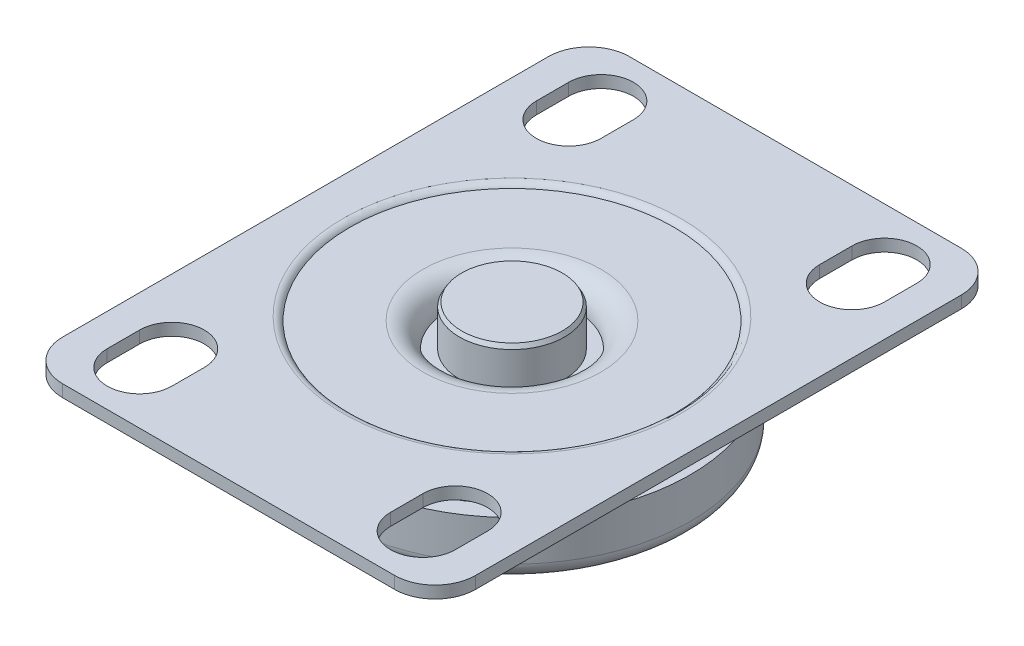
ISO-10303-21;
HEADER;
FILE_DESCRIPTION(('STEP AP214'),'2;1');
FILE_NAME('part.step','',(''),(''),'','','');
FILE_SCHEMA(('AUTOMOTIVE_DESIGN { 1 0 10303 214 1 1 1 1 }'));
ENDSEC;
DATA;
#1=APPLICATION_CONTEXT('core data for automotive mechanical design processes');
#2=APPLICATION_PROTOCOL_DEFINITION('international standard','automotive_design',2000,#1);
#3=PRODUCT_CONTEXT('',#1,'mechanical');
#4=PRODUCT('Part','Part','',(#3));
#5=PRODUCT_RELATED_PRODUCT_CATEGORY('part','',(#4));
#6=PRODUCT_DEFINITION_FORMATION('','',#4);
#7=PRODUCT_DEFINITION_CONTEXT('part definition',#1,'design');
#8=PRODUCT_DEFINITION('design','',#6,#7);
#9=PRODUCT_DEFINITION_SHAPE('','',#8);
#10=(LENGTH_UNIT() NAMED_UNIT(*) SI_UNIT(.MILLI.,.METRE.));
#11=(NAMED_UNIT(*) PLANE_ANGLE_UNIT() SI_UNIT($,.RADIAN.));
#12=(NAMED_UNIT(*) SI_UNIT($,.STERADIAN.) SOLID_ANGLE_UNIT());
#13=UNCERTAINTY_MEASURE_WITH_UNIT(LENGTH_MEASURE(1.E-05),#10,'distance_accuracy_value','');
#14=(GEOMETRIC_REPRESENTATION_CONTEXT(3) GLOBAL_UNCERTAINTY_ASSIGNED_CONTEXT((#13)) GLOBAL_UNIT_ASSIGNED_CONTEXT((#10,
#11,#12)) REPRESENTATION_CONTEXT('',''));
#15=CARTESIAN_POINT('',(0.,0.,0.));
#16=DIRECTION('',(0.,0.,1.));
#17=DIRECTION('',(1.,0.,0.));
#18=AXIS2_PLACEMENT_3D('',#15,#16,#17);
#19=CARTESIAN_POINT('',(0.,-3.,0.));
#20=DIRECTION('',(0.,-1.,0.));
#21=DIRECTION('',(0.,0.,-1.));
#22=AXIS2_PLACEMENT_3D('',#19,#20,#21);
#23=PLANE('',#22);
#24=CARTESIAN_POINT('',(0.,-3.,0.));
#25=DIRECTION('',(0.,-1.,0.));
#26=DIRECTION('',(0.,0.,-1.));
#27=AXIS2_PLACEMENT_3D('',#24,#25,#26);
#28=CIRCLE('',#27,22.);
#29=CARTESIAN_POINT('',(0.,-3.,-22.));
#30=VERTEX_POINT('',#29);
#31=EDGE_CURVE('E585',#30,#30,#28,.T.);
#32=ORIENTED_EDGE('',*,*,#31,.T.);
#33=EDGE_LOOP('',(#32));
#34=FACE_BOUND('',#33,.T.);
#35=CARTESIAN_POINT('',(0.,-3.,0.));
#36=DIRECTION('',(0.,-1.,0.));
#37=DIRECTION('',(0.,0.,-1.));
#38=AXIS2_PLACEMENT_3D('',#35,#36,#37);
#39=CIRCLE('',#38,7.5);
#40=CARTESIAN_POINT('',(0.,-3.,-7.5));
#41=VERTEX_POINT('',#40);
#42=EDGE_CURVE('E578',#41,#41,#39,.T.);
#43=ORIENTED_EDGE('',*,*,#42,.F.);
#44=EDGE_LOOP('',(#43));
#45=FACE_BOUND('',#44,.T.);
#46=ADVANCED_FACE('F35',(#34,#45),#23,.T.);
#47=CARTESIAN_POINT('',(0.,1.,0.));
#48=DIRECTION('',(0.,1.,0.));
#49=DIRECTION('',(0.,0.,1.));
#50=AXIS2_PLACEMENT_3D('',#47,#48,#49);
#51=PLANE('',#50);
#52=CARTESIAN_POINT('',(0.,1.,0.));
#53=DIRECTION('',(0.,1.,0.));
#54=DIRECTION('',(0.,0.,1.));
#55=AXIS2_PLACEMENT_3D('',#52,#53,#54);
#56=CIRCLE('',#55,11.);
#57=CARTESIAN_POINT('',(0.,1.,11.));
#58=VERTEX_POINT('',#57);
#59=EDGE_CURVE('E11',#58,#58,#56,.F.);
#60=ORIENTED_EDGE('',*,*,#59,.T.);
#61=EDGE_LOOP('',(#60));
#62=FACE_BOUND('',#61,.T.);
#63=CARTESIAN_POINT('',(0.,1.,0.));
#64=DIRECTION('',(0.,1.,0.));
#65=DIRECTION('',(0.,0.,1.));
#66=AXIS2_PLACEMENT_3D('',#63,#64,#65);
#67=CIRCLE('',#66,20.);
#68=CARTESIAN_POINT('',(0.,1.,20.));
#69=VERTEX_POINT('',#68);
#70=EDGE_CURVE('E386',#69,#69,#67,.T.);
#71=ORIENTED_EDGE('',*,*,#70,.T.);
#72=EDGE_LOOP('',(#71));
#73=FACE_BOUND('',#72,.T.);
#74=ADVANCED_FACE('F420',(#62,#73),#51,.T.);
#75=CARTESIAN_POINT('',(-20.5,0.,30.));
#76=DIRECTION('',(0.,-1.,0.));
#77=DIRECTION('',(0.,0.,-1.));
#78=AXIS2_PLACEMENT_3D('',#75,#76,#77);
#79=PLANE('',#78);
#80=DIRECTION('',(0.,0.,-1.));
#81=VECTOR('',#80,1.);
#82=CARTESIAN_POINT('',(21.5,0.,30.));
#83=LINE('',#82,#81);
#84=CARTESIAN_POINT('',(21.5,0.,28.5));
#85=VERTEX_POINT('',#84);
#86=CARTESIAN_POINT('',(21.5,0.,24.5));
#87=VERTEX_POINT('',#86);
#88=EDGE_CURVE('E376',#85,#87,#83,.T.);
#89=ORIENTED_EDGE('',*,*,#88,.T.);
#90=CARTESIAN_POINT('',(17.5,0.,24.5));
#91=DIRECTION('',(0.,-1.,0.));
#92=DIRECTION('',(0.,0.,-1.));
#93=AXIS2_PLACEMENT_3D('',#90,#91,#92);
#94=CIRCLE('',#93,4.);
#95=CARTESIAN_POINT('',(13.5,0.,24.5));
#96=VERTEX_POINT('',#95);
#97=EDGE_CURVE('E379',#87,#96,#94,.F.);
#98=ORIENTED_EDGE('',*,*,#97,.T.);
#99=DIRECTION('',(0.,0.,1.));
#100=VECTOR('',#99,1.);
#101=CARTESIAN_POINT('',(13.5,0.,30.));
#102=LINE('',#101,#100);
#103=CARTESIAN_POINT('',(13.5,0.,28.5));
#104=VERTEX_POINT('',#103);
#105=EDGE_CURVE('E373',#96,#104,#102,.T.);
#106=ORIENTED_EDGE('',*,*,#105,.T.);
#107=CARTESIAN_POINT('',(17.5,0.,28.5));
#108=DIRECTION('',(0.,-1.,0.));
#109=DIRECTION('',(0.,0.,-1.));
#110=AXIS2_PLACEMENT_3D('',#107,#108,#109);
#111=CIRCLE('',#110,4.);
#112=EDGE_CURVE('E203',#104,#85,#111,.F.);
#113=ORIENTED_EDGE('',*,*,#112,.T.);
#114=EDGE_LOOP('',(#89,#98,#106,#113));
#115=FACE_BOUND('',#114,.T.);
#116=CARTESIAN_POINT('',(-20.5,0.,30.));
#117=DIRECTION('',(0.,1.,0.));
#118=DIRECTION('',(0.,0.,-1.));
#119=AXIS2_PLACEMENT_3D('',#116,#117,#118);
#120=CIRCLE('',#119,5.);
#121=CARTESIAN_POINT('',(-25.5,0.,30.));
#122=VERTEX_POINT('',#121);
#123=CARTESIAN_POINT('',(-20.5,0.,35.));
#124=VERTEX_POINT('',#123);
#125=EDGE_CURVE('E279',#122,#124,#120,.T.);
#126=ORIENTED_EDGE('',*,*,#125,.F.);
#127=DIRECTION('',(0.,0.,1.));
#128=VECTOR('',#127,1.);
#129=CARTESIAN_POINT('',(-25.5,0.,30.));
#130=LINE('',#129,#128);
#131=CARTESIAN_POINT('',(-25.5,0.,-30.));
#132=VERTEX_POINT('',#131);
#133=EDGE_CURVE('E290',#132,#122,#130,.T.);
#134=ORIENTED_EDGE('',*,*,#133,.F.);
#135=CARTESIAN_POINT('',(-20.5,0.,-30.));
#136=DIRECTION('',(0.,1.,0.));
#137=DIRECTION('',(0.,0.,-1.));
#138=AXIS2_PLACEMENT_3D('',#135,#136,#137);
#139=CIRCLE('',#138,5.);
#140=CARTESIAN_POINT('',(-20.5,0.,-35.));
#141=VERTEX_POINT('',#140);
#142=EDGE_CURVE('E317',#141,#132,#139,.T.);
#143=ORIENTED_EDGE('',*,*,#142,.F.);
#144=DIRECTION('',(-1.,0.,0.));
#145=VECTOR('',#144,1.);
#146=CARTESIAN_POINT('',(-20.5,0.,-35.));
#147=LINE('',#146,#145);
#148=CARTESIAN_POINT('',(20.5,0.,-35.));
#149=VERTEX_POINT('',#148);
#150=EDGE_CURVE('E315',#149,#141,#147,.T.);
#151=ORIENTED_EDGE('',*,*,#150,.F.);
#152=CARTESIAN_POINT('',(20.5,0.,-30.));
#153=DIRECTION('',(0.,1.,0.));
#154=DIRECTION('',(0.,0.,-1.));
#155=AXIS2_PLACEMENT_3D('',#152,#153,#154);
#156=CIRCLE('',#155,5.);
#157=CARTESIAN_POINT('',(25.5,0.,-30.));
#158=VERTEX_POINT('',#157);
#159=EDGE_CURVE('E313',#158,#149,#156,.T.);
#160=ORIENTED_EDGE('',*,*,#159,.F.);
#161=DIRECTION('',(0.,0.,-1.));
#162=VECTOR('',#161,1.);
#163=CARTESIAN_POINT('',(25.5,0.,30.));
#164=LINE('',#163,#162);
#165=CARTESIAN_POINT('',(25.5,0.,30.));
#166=VERTEX_POINT('',#165);
#167=EDGE_CURVE('E311',#166,#158,#164,.T.);
#168=ORIENTED_EDGE('',*,*,#167,.F.);
#169=CARTESIAN_POINT('',(20.5,0.,30.));
#170=DIRECTION('',(0.,1.,0.));
#171=DIRECTION('',(0.,0.,1.));
#172=AXIS2_PLACEMENT_3D('',#169,#170,#171);
#173=CIRCLE('',#172,5.);
#174=CARTESIAN_POINT('',(20.5,0.,35.));
#175=VERTEX_POINT('',#174);
#176=EDGE_CURVE('E309',#175,#166,#173,.T.);
#177=ORIENTED_EDGE('',*,*,#176,.F.);
#178=DIRECTION('',(1.,0.,0.));
#179=VECTOR('',#178,1.);
#180=CARTESIAN_POINT('',(-20.5,0.,35.));
#181=LINE('',#180,#179);
#182=EDGE_CURVE('E307',#124,#175,#181,.T.);
#183=ORIENTED_EDGE('',*,*,#182,.F.);
#184=EDGE_LOOP('',(#126,#134,#143,#151,#160,#168,#177,#183));
#185=FACE_BOUND('',#184,.T.);
#186=CARTESIAN_POINT('',(-17.5,0.,-24.5));
#187=DIRECTION('',(0.,-1.,0.));
#188=DIRECTION('',(0.,0.,-1.));
#189=AXIS2_PLACEMENT_3D('',#186,#187,#188);
#190=CIRCLE('',#189,4.);
#191=CARTESIAN_POINT('',(-13.5,0.,-24.5));
#192=VERTEX_POINT('',#191);
#193=CARTESIAN_POINT('',(-21.5,0.,-24.5));
#194=VERTEX_POINT('',#193);
#195=EDGE_CURVE('E350',#192,#194,#190,.T.);
#196=ORIENTED_EDGE('',*,*,#195,.F.);
#197=DIRECTION('',(0.,0.,1.));
#198=VECTOR('',#197,1.);
#199=CARTESIAN_POINT('',(-13.5,0.,30.));
#200=LINE('',#199,#198);
#201=CARTESIAN_POINT('',(-13.5,0.,-28.5));
#202=VERTEX_POINT('',#201);
#203=EDGE_CURVE('E343',#202,#192,#200,.T.);
#204=ORIENTED_EDGE('',*,*,#203,.F.);
#205=CARTESIAN_POINT('',(-17.5,0.,-28.5));
#206=DIRECTION('',(0.,-1.,0.));
#207=DIRECTION('',(0.,0.,-1.));
#208=AXIS2_PLACEMENT_3D('',#205,#206,#207);
#209=CIRCLE('',#208,4.);
#210=CARTESIAN_POINT('',(-21.5,0.,-28.5));
#211=VERTEX_POINT('',#210);
#212=EDGE_CURVE('E345',#211,#202,#209,.T.);
#213=ORIENTED_EDGE('',*,*,#212,.F.);
#214=DIRECTION('',(0.,0.,-1.));
#215=VECTOR('',#214,1.);
#216=CARTESIAN_POINT('',(-21.5,0.,30.));
#217=LINE('',#216,#215);
#218=EDGE_CURVE('E348',#194,#211,#217,.T.);
#219=ORIENTED_EDGE('',*,*,#218,.F.);
#220=EDGE_LOOP('',(#196,#204,#213,#219));
#221=FACE_BOUND('',#220,.T.);
#222=CARTESIAN_POINT('',(17.5,0.,-24.5));
#223=DIRECTION('',(0.,-1.,0.));
#224=DIRECTION('',(0.,0.,-1.));
#225=AXIS2_PLACEMENT_3D('',#222,#223,#224);
#226=CIRCLE('',#225,4.);
#227=CARTESIAN_POINT('',(21.5,0.,-24.5));
#228=VERTEX_POINT('',#227);
#229=CARTESIAN_POINT('',(13.5,0.,-24.5));
#230=VERTEX_POINT('',#229);
#231=EDGE_CURVE('E359',#228,#230,#226,.T.);
#232=ORIENTED_EDGE('',*,*,#231,.F.);
#233=DIRECTION('',(0.,0.,1.));
#234=VECTOR('',#233,1.);
#235=CARTESIAN_POINT('',(21.5,0.,30.));
#236=LINE('',#235,#234);
#237=CARTESIAN_POINT('',(21.5,0.,-28.5));
#238=VERTEX_POINT('',#237);
#239=EDGE_CURVE('E352',#238,#228,#236,.T.);
#240=ORIENTED_EDGE('',*,*,#239,.F.);
#241=CARTESIAN_POINT('',(17.5,0.,-28.5));
#242=DIRECTION('',(0.,-1.,0.));
#243=DIRECTION('',(0.,0.,-1.));
#244=AXIS2_PLACEMENT_3D('',#241,#242,#243);
#245=CIRCLE('',#244,4.);
#246=CARTESIAN_POINT('',(13.5,0.,-28.5));
#247=VERTEX_POINT('',#246);
#248=EDGE_CURVE('E354',#247,#238,#245,.T.);
#249=ORIENTED_EDGE('',*,*,#248,.F.);
#250=DIRECTION('',(0.,0.,-1.));
#251=VECTOR('',#250,1.);
#252=CARTESIAN_POINT('',(13.5,0.,30.));
#253=LINE('',#252,#251);
#254=EDGE_CURVE('E357',#230,#247,#253,.T.);
#255=ORIENTED_EDGE('',*,*,#254,.F.);
#256=EDGE_LOOP('',(#232,#240,#249,#255));
#257=FACE_BOUND('',#256,.T.);
#258=DIRECTION('',(0.,0.,-1.));
#259=VECTOR('',#258,1.);
#260=CARTESIAN_POINT('',(-13.5,0.,30.));
#261=LINE('',#260,#259);
#262=CARTESIAN_POINT('',(-13.5,0.,28.5));
#263=VERTEX_POINT('',#262);
#264=CARTESIAN_POINT('',(-13.5,0.,24.5));
#265=VERTEX_POINT('',#264);
#266=EDGE_CURVE('E367',#263,#265,#261,.T.);
#267=ORIENTED_EDGE('',*,*,#266,.T.);
#268=CARTESIAN_POINT('',(-17.5,0.,24.5));
#269=DIRECTION('',(0.,-1.,0.));
#270=DIRECTION('',(0.,0.,-1.));
#271=AXIS2_PLACEMENT_3D('',#268,#269,#270);
#272=CIRCLE('',#271,4.);
#273=CARTESIAN_POINT('',(-21.5,0.,24.5));
#274=VERTEX_POINT('',#273);
#275=EDGE_CURVE('E370',#265,#274,#272,.F.);
#276=ORIENTED_EDGE('',*,*,#275,.T.);
#277=DIRECTION('',(0.,0.,1.));
#278=VECTOR('',#277,1.);
#279=CARTESIAN_POINT('',(-21.5,0.,30.));
#280=LINE('',#279,#278);
#281=CARTESIAN_POINT('',(-21.5,0.,28.5));
#282=VERTEX_POINT('',#281);
#283=EDGE_CURVE('E361',#274,#282,#280,.T.);
#284=ORIENTED_EDGE('',*,*,#283,.T.);
#285=CARTESIAN_POINT('',(-17.5,0.,28.5));
#286=DIRECTION('',(0.,-1.,0.));
#287=DIRECTION('',(0.,0.,-1.));
#288=AXIS2_PLACEMENT_3D('',#285,#286,#287);
#289=CIRCLE('',#288,4.);
#290=EDGE_CURVE('E364',#282,#263,#289,.F.);
#291=ORIENTED_EDGE('',*,*,#290,.T.);
#292=EDGE_LOOP('',(#267,#276,#284,#291));
#293=FACE_BOUND('',#292,.T.);
#294=CARTESIAN_POINT('',(0.,0.,0.));
#295=DIRECTION('',(0.,-1.,0.));
#296=DIRECTION('',(0.,0.,-1.));
#297=AXIS2_PLACEMENT_3D('',#294,#295,#296);
#298=CIRCLE('',#297,22.);
#299=CARTESIAN_POINT('',(0.,0.,-22.));
#300=VERTEX_POINT('',#299);
#301=EDGE_CURVE('E582',#300,#300,#298,.T.);
#302=ORIENTED_EDGE('',*,*,#301,.F.);
#303=EDGE_LOOP('',(#302));
#304=FACE_BOUND('',#303,.T.);
#305=ADVANCED_FACE('F426',(#115,#185,#221,#257,#293,#304),#79,.T.);
#306=CARTESIAN_POINT('',(-20.5,1.5,30.));
#307=DIRECTION('',(0.,-1.,0.));
#308=DIRECTION('',(0.,0.,-1.));
#309=AXIS2_PLACEMENT_3D('',#306,#307,#308);
#310=PLANE('',#309);
#311=CARTESIAN_POINT('',(0.,1.5,0.));
#312=DIRECTION('',(0.,-1.,0.));
#313=DIRECTION('',(0.,0.,-1.));
#314=AXIS2_PLACEMENT_3D('',#311,#312,#313);
#315=CIRCLE('',#314,20.8660254037844);
#316=CARTESIAN_POINT('',(0.,1.5,-20.8660254037844));
#317=VERTEX_POINT('',#316);
#318=EDGE_CURVE('E382',#317,#317,#315,.T.);
#319=ORIENTED_EDGE('',*,*,#318,.T.);
#320=EDGE_LOOP('',(#319));
#321=FACE_BOUND('',#320,.T.);
#322=CARTESIAN_POINT('',(-17.5,1.5,24.5));
#323=DIRECTION('',(0.,-1.,0.));
#324=DIRECTION('',(0.,0.,-1.));
#325=AXIS2_PLACEMENT_3D('',#322,#323,#324);
#326=CIRCLE('',#325,4.);
#327=CARTESIAN_POINT('',(-21.5,1.5,24.5));
#328=VERTEX_POINT('',#327);
#329=CARTESIAN_POINT('',(-13.5,1.5,24.5));
#330=VERTEX_POINT('',#329);
#331=EDGE_CURVE('E222',#328,#330,#326,.T.);
#332=ORIENTED_EDGE('',*,*,#331,.T.);
#333=DIRECTION('',(0.,0.,1.));
#334=VECTOR('',#333,1.);
#335=CARTESIAN_POINT('',(-13.5,1.5,24.5));
#336=LINE('',#335,#334);
#337=CARTESIAN_POINT('',(-13.5,1.5,28.5));
#338=VERTEX_POINT('',#337);
#339=EDGE_CURVE('E233',#330,#338,#336,.T.);
#340=ORIENTED_EDGE('',*,*,#339,.T.);
#341=CARTESIAN_POINT('',(-17.5,1.5,28.5));
#342=DIRECTION('',(0.,-1.,0.));
#343=DIRECTION('',(0.,0.,-1.));
#344=AXIS2_PLACEMENT_3D('',#341,#342,#343);
#345=CIRCLE('',#344,4.);
#346=CARTESIAN_POINT('',(-21.5,1.5,28.5));
#347=VERTEX_POINT('',#346);
#348=EDGE_CURVE('E230',#338,#347,#345,.T.);
#349=ORIENTED_EDGE('',*,*,#348,.T.);
#350=DIRECTION('',(0.,0.,-1.));
#351=VECTOR('',#350,1.);
#352=CARTESIAN_POINT('',(-21.5,1.5,24.5));
#353=LINE('',#352,#351);
#354=EDGE_CURVE('E227',#347,#328,#353,.T.);
#355=ORIENTED_EDGE('',*,*,#354,.T.);
#356=EDGE_LOOP('',(#332,#340,#349,#355));
#357=FACE_BOUND('',#356,.T.);
#358=DIRECTION('',(0.,0.,-1.));
#359=VECTOR('',#358,1.);
#360=CARTESIAN_POINT('',(21.5,1.5,-24.5));
#361=LINE('',#360,#359);
#362=CARTESIAN_POINT('',(21.5,1.5,-24.5));
#363=VERTEX_POINT('',#362);
#364=CARTESIAN_POINT('',(21.5,1.5,-28.5));
#365=VERTEX_POINT('',#364);
#366=EDGE_CURVE('E247',#363,#365,#361,.T.);
#367=ORIENTED_EDGE('',*,*,#366,.F.);
#368=CARTESIAN_POINT('',(17.5,1.5,-24.5));
#369=DIRECTION('',(0.,1.,0.));
#370=DIRECTION('',(0.,0.,1.));
#371=AXIS2_PLACEMENT_3D('',#368,#369,#370);
#372=CIRCLE('',#371,4.);
#373=CARTESIAN_POINT('',(13.5,1.5,-24.5));
#374=VERTEX_POINT('',#373);
#375=EDGE_CURVE('E239',#374,#363,#372,.T.);
#376=ORIENTED_EDGE('',*,*,#375,.F.);
#377=DIRECTION('',(0.,0.,1.));
#378=VECTOR('',#377,1.);
#379=CARTESIAN_POINT('',(13.5,1.5,-24.5));
#380=LINE('',#379,#378);
#381=CARTESIAN_POINT('',(13.5,1.5,-28.5));
#382=VERTEX_POINT('',#381);
#383=EDGE_CURVE('E253',#382,#374,#380,.T.);
#384=ORIENTED_EDGE('',*,*,#383,.F.);
#385=CARTESIAN_POINT('',(17.5,1.5,-28.5));
#386=DIRECTION('',(0.,1.,0.));
#387=DIRECTION('',(0.,0.,1.));
#388=AXIS2_PLACEMENT_3D('',#385,#386,#387);
#389=CIRCLE('',#388,4.);
#390=EDGE_CURVE('E250',#365,#382,#389,.T.);
#391=ORIENTED_EDGE('',*,*,#390,.F.);
#392=EDGE_LOOP('',(#367,#376,#384,#391));
#393=FACE_BOUND('',#392,.T.);
#394=DIRECTION('',(0.,0.,-1.));
#395=VECTOR('',#394,1.);
#396=CARTESIAN_POINT('',(-13.5,1.5,-24.5));
#397=LINE('',#396,#395);
#398=CARTESIAN_POINT('',(-13.5,1.5,-24.5));
#399=VERTEX_POINT('',#398);
#400=CARTESIAN_POINT('',(-13.5,1.5,-28.5));
#401=VERTEX_POINT('',#400);
#402=EDGE_CURVE('E267',#399,#401,#397,.T.);
#403=ORIENTED_EDGE('',*,*,#402,.F.);
#404=CARTESIAN_POINT('',(-17.5,1.5,-24.5));
#405=DIRECTION('',(0.,1.,0.));
#406=DIRECTION('',(0.,0.,1.));
#407=AXIS2_PLACEMENT_3D('',#404,#405,#406);
#408=CIRCLE('',#407,4.);
#409=CARTESIAN_POINT('',(-21.5,1.5,-24.5));
#410=VERTEX_POINT('',#409);
#411=EDGE_CURVE('E259',#410,#399,#408,.T.);
#412=ORIENTED_EDGE('',*,*,#411,.F.);
#413=DIRECTION('',(0.,0.,1.));
#414=VECTOR('',#413,1.);
#415=CARTESIAN_POINT('',(-21.5,1.5,-24.5));
#416=LINE('',#415,#414);
#417=CARTESIAN_POINT('',(-21.5,1.5,-28.5));
#418=VERTEX_POINT('',#417);
#419=EDGE_CURVE('E273',#418,#410,#416,.T.);
#420=ORIENTED_EDGE('',*,*,#419,.F.);
#421=CARTESIAN_POINT('',(-17.5,1.5,-28.5));
#422=DIRECTION('',(0.,1.,0.));
#423=DIRECTION('',(0.,0.,1.));
#424=AXIS2_PLACEMENT_3D('',#421,#422,#423);
#425=CIRCLE('',#424,4.);
#426=EDGE_CURVE('E270',#401,#418,#425,.T.);
#427=ORIENTED_EDGE('',*,*,#426,.F.);
#428=EDGE_LOOP('',(#403,#412,#420,#427));
#429=FACE_BOUND('',#428,.T.);
#430=CARTESIAN_POINT('',(-20.5,1.5,30.));
#431=DIRECTION('',(0.,1.,0.));
#432=DIRECTION('',(0.,0.,-1.));
#433=AXIS2_PLACEMENT_3D('',#430,#431,#432);
#434=CIRCLE('',#433,5.);
#435=CARTESIAN_POINT('',(-25.5,1.5,30.));
#436=VERTEX_POINT('',#435);
#437=CARTESIAN_POINT('',(-20.5,1.5,35.));
#438=VERTEX_POINT('',#437);
#439=EDGE_CURVE('E286',#436,#438,#434,.T.);
#440=ORIENTED_EDGE('',*,*,#439,.T.);
#441=DIRECTION('',(1.,0.,0.));
#442=VECTOR('',#441,1.);
#443=CARTESIAN_POINT('',(-20.5,1.5,35.));
#444=LINE('',#443,#442);
#445=CARTESIAN_POINT('',(20.5,1.5,35.));
#446=VERTEX_POINT('',#445);
#447=EDGE_CURVE('E289',#438,#446,#444,.T.);
#448=ORIENTED_EDGE('',*,*,#447,.T.);
#449=CARTESIAN_POINT('',(20.5,1.5,30.));
#450=DIRECTION('',(0.,1.,0.));
#451=DIRECTION('',(0.,0.,1.));
#452=AXIS2_PLACEMENT_3D('',#449,#450,#451);
#453=CIRCLE('',#452,5.);
#454=CARTESIAN_POINT('',(25.5,1.5,30.));
#455=VERTEX_POINT('',#454);
#456=EDGE_CURVE('E292',#446,#455,#453,.T.);
#457=ORIENTED_EDGE('',*,*,#456,.T.);
#458=DIRECTION('',(0.,0.,-1.));
#459=VECTOR('',#458,1.);
#460=CARTESIAN_POINT('',(25.5,1.5,30.));
#461=LINE('',#460,#459);
#462=CARTESIAN_POINT('',(25.5,1.5,-30.));
#463=VERTEX_POINT('',#462);
#464=EDGE_CURVE('E294',#455,#463,#461,.T.);
#465=ORIENTED_EDGE('',*,*,#464,.T.);
#466=CARTESIAN_POINT('',(20.5,1.5,-30.));
#467=DIRECTION('',(0.,1.,0.));
#468=DIRECTION('',(0.,0.,-1.));
#469=AXIS2_PLACEMENT_3D('',#466,#467,#468);
#470=CIRCLE('',#469,5.);
#471=CARTESIAN_POINT('',(20.5,1.5,-35.));
#472=VERTEX_POINT('',#471);
#473=EDGE_CURVE('E296',#463,#472,#470,.T.);
#474=ORIENTED_EDGE('',*,*,#473,.T.);
#475=DIRECTION('',(-1.,0.,0.));
#476=VECTOR('',#475,1.);
#477=CARTESIAN_POINT('',(-20.5,1.5,-35.));
#478=LINE('',#477,#476);
#479=CARTESIAN_POINT('',(-20.5,1.5,-35.));
#480=VERTEX_POINT('',#479);
#481=EDGE_CURVE('E298',#472,#480,#478,.T.);
#482=ORIENTED_EDGE('',*,*,#481,.T.);
#483=CARTESIAN_POINT('',(-20.5,1.5,-30.));
#484=DIRECTION('',(0.,1.,0.));
#485=DIRECTION('',(0.,0.,-1.));
#486=AXIS2_PLACEMENT_3D('',#483,#484,#485);
#487=CIRCLE('',#486,5.);
#488=CARTESIAN_POINT('',(-25.5,1.5,-30.));
#489=VERTEX_POINT('',#488);
#490=EDGE_CURVE('E300',#480,#489,#487,.T.);
#491=ORIENTED_EDGE('',*,*,#490,.T.);
#492=DIRECTION('',(0.,0.,1.));
#493=VECTOR('',#492,1.);
#494=CARTESIAN_POINT('',(-25.5,1.5,30.));
#495=LINE('',#494,#493);
#496=EDGE_CURVE('E302',#489,#436,#495,.T.);
#497=ORIENTED_EDGE('',*,*,#496,.T.);
#498=EDGE_LOOP('',(#440,#448,#457,#465,#474,#482,#491,#497));
#499=FACE_BOUND('',#498,.T.);
#500=CARTESIAN_POINT('',(17.5,1.5,24.5));
#501=DIRECTION('',(0.,-1.,0.));
#502=DIRECTION('',(0.,0.,-1.));
#503=AXIS2_PLACEMENT_3D('',#500,#501,#502);
#504=CIRCLE('',#503,4.);
#505=CARTESIAN_POINT('',(13.5,1.5,24.5));
#506=VERTEX_POINT('',#505);
#507=CARTESIAN_POINT('',(21.5,1.5,24.5));
#508=VERTEX_POINT('',#507);
#509=EDGE_CURVE('E51',#506,#508,#504,.T.);
#510=ORIENTED_EDGE('',*,*,#509,.T.);
#511=DIRECTION('',(0.,0.,1.));
#512=VECTOR('',#511,1.);
#513=CARTESIAN_POINT('',(21.5,1.5,24.5));
#514=LINE('',#513,#512);
#515=CARTESIAN_POINT('',(21.5,1.5,28.5));
#516=VERTEX_POINT('',#515);
#517=EDGE_CURVE('E215',#508,#516,#514,.T.);
#518=ORIENTED_EDGE('',*,*,#517,.T.);
#519=CARTESIAN_POINT('',(17.5,1.5,28.5));
#520=DIRECTION('',(0.,-1.,0.));
#521=DIRECTION('',(0.,0.,-1.));
#522=AXIS2_PLACEMENT_3D('',#519,#520,#521);
#523=CIRCLE('',#522,4.);
#524=CARTESIAN_POINT('',(13.5,1.5,28.5));
#525=VERTEX_POINT('',#524);
#526=EDGE_CURVE('E200',#516,#525,#523,.T.);
#527=ORIENTED_EDGE('',*,*,#526,.T.);
#528=DIRECTION('',(0.,0.,-1.));
#529=VECTOR('',#528,1.);
#530=CARTESIAN_POINT('',(13.5,1.5,24.5));
#531=LINE('',#530,#529);
#532=EDGE_CURVE('E209',#525,#506,#531,.T.);
#533=ORIENTED_EDGE('',*,*,#532,.T.);
#534=EDGE_LOOP('',(#510,#518,#527,#533));
#535=FACE_BOUND('',#534,.T.);
#536=ADVANCED_FACE('F213',(#321,#357,#393,#429,#499,#535),#310,.F.);
#537=CARTESIAN_POINT('',(-20.5,1.5,30.));
#538=DIRECTION('',(0.,-1.,0.));
#539=DIRECTION('',(0.,0.,-1.));
#540=AXIS2_PLACEMENT_3D('',#537,#538,#539);
#541=CYLINDRICAL_SURFACE('',#540,5.);
#542=ORIENTED_EDGE('',*,*,#125,.T.);
#543=DIRECTION('',(0.,-1.,0.));
#544=VECTOR('',#543,1.);
#545=CARTESIAN_POINT('',(-20.5,1.5,35.));
#546=LINE('',#545,#544);
#547=EDGE_CURVE('E340',#438,#124,#546,.T.);
#548=ORIENTED_EDGE('',*,*,#547,.F.);
#549=ORIENTED_EDGE('',*,*,#439,.F.);
#550=DIRECTION('',(0.,-1.,0.));
#551=VECTOR('',#550,1.);
#552=CARTESIAN_POINT('',(-25.5,1.5,30.));
#553=LINE('',#552,#551);
#554=EDGE_CURVE('E304',#436,#122,#553,.T.);
#555=ORIENTED_EDGE('',*,*,#554,.T.);
#556=EDGE_LOOP('',(#542,#548,#549,#555));
#557=FACE_BOUND('',#556,.T.);
#558=ADVANCED_FACE('F513',(#557),#541,.T.);
#559=CARTESIAN_POINT('',(-20.5,1.5,35.));
#560=DIRECTION('',(0.,0.,-1.));
#561=DIRECTION('',(-1.,0.,0.));
#562=AXIS2_PLACEMENT_3D('',#559,#560,#561);
#563=PLANE('',#562);
#564=ORIENTED_EDGE('',*,*,#182,.T.);
#565=DIRECTION('',(0.,-1.,0.));
#566=VECTOR('',#565,1.);
#567=CARTESIAN_POINT('',(20.5,1.5,35.));
#568=LINE('',#567,#566);
#569=EDGE_CURVE('E337',#446,#175,#568,.T.);
#570=ORIENTED_EDGE('',*,*,#569,.F.);
#571=ORIENTED_EDGE('',*,*,#447,.F.);
#572=ORIENTED_EDGE('',*,*,#547,.T.);
#573=EDGE_LOOP('',(#564,#570,#571,#572));
#574=FACE_BOUND('',#573,.T.);
#575=ADVANCED_FACE('F540',(#574),#563,.F.);
#576=CARTESIAN_POINT('',(20.5,1.5,30.));
#577=DIRECTION('',(0.,-1.,0.));
#578=DIRECTION('',(0.,0.,-1.));
#579=AXIS2_PLACEMENT_3D('',#576,#577,#578);
#580=CYLINDRICAL_SURFACE('',#579,5.);
#581=ORIENTED_EDGE('',*,*,#176,.T.);
#582=DIRECTION('',(0.,-1.,0.));
#583=VECTOR('',#582,1.);
#584=CARTESIAN_POINT('',(25.5,1.5,30.));
#585=LINE('',#584,#583);
#586=EDGE_CURVE('E334',#455,#166,#585,.T.);
#587=ORIENTED_EDGE('',*,*,#586,.F.);
#588=ORIENTED_EDGE('',*,*,#456,.F.);
#589=ORIENTED_EDGE('',*,*,#569,.T.);
#590=EDGE_LOOP('',(#581,#587,#588,#589));
#591=FACE_BOUND('',#590,.T.);
#592=ADVANCED_FACE('F536',(#591),#580,.T.);
#593=CARTESIAN_POINT('',(25.5,1.5,30.));
#594=DIRECTION('',(-1.,0.,0.));
#595=DIRECTION('',(0.,0.,1.));
#596=AXIS2_PLACEMENT_3D('',#593,#594,#595);
#597=PLANE('',#596);
#598=ORIENTED_EDGE('',*,*,#167,.T.);
#599=DIRECTION('',(0.,-1.,0.));
#600=VECTOR('',#599,1.);
#601=CARTESIAN_POINT('',(25.5,1.5,-30.));
#602=LINE('',#601,#600);
#603=EDGE_CURVE('E331',#463,#158,#602,.T.);
#604=ORIENTED_EDGE('',*,*,#603,.F.);
#605=ORIENTED_EDGE('',*,*,#464,.F.);
#606=ORIENTED_EDGE('',*,*,#586,.T.);
#607=EDGE_LOOP('',(#598,#604,#605,#606));
#608=FACE_BOUND('',#607,.T.);
#609=ADVANCED_FACE('F532',(#608),#597,.F.);
#610=CARTESIAN_POINT('',(20.5,1.5,-30.));
#611=DIRECTION('',(0.,-1.,0.));
#612=DIRECTION('',(0.,0.,-1.));
#613=AXIS2_PLACEMENT_3D('',#610,#611,#612);
#614=CYLINDRICAL_SURFACE('',#613,5.);
#615=ORIENTED_EDGE('',*,*,#159,.T.);
#616=DIRECTION('',(0.,-1.,0.));
#617=VECTOR('',#616,1.);
#618=CARTESIAN_POINT('',(20.5,1.5,-35.));
#619=LINE('',#618,#617);
#620=EDGE_CURVE('E328',#472,#149,#619,.T.);
#621=ORIENTED_EDGE('',*,*,#620,.F.);
#622=ORIENTED_EDGE('',*,*,#473,.F.);
#623=ORIENTED_EDGE('',*,*,#603,.T.);
#624=EDGE_LOOP('',(#615,#621,#622,#623));
#625=FACE_BOUND('',#624,.T.);
#626=ADVANCED_FACE('F528',(#625),#614,.T.);
#627=CARTESIAN_POINT('',(-20.5,1.5,-35.));
#628=DIRECTION('',(0.,0.,1.));
#629=DIRECTION('',(1.,0.,0.));
#630=AXIS2_PLACEMENT_3D('',#627,#628,#629);
#631=PLANE('',#630);
#632=ORIENTED_EDGE('',*,*,#150,.T.);
#633=DIRECTION('',(0.,-1.,0.));
#634=VECTOR('',#633,1.);
#635=CARTESIAN_POINT('',(-20.5,1.5,-35.));
#636=LINE('',#635,#634);
#637=EDGE_CURVE('E325',#480,#141,#636,.T.);
#638=ORIENTED_EDGE('',*,*,#637,.F.);
#639=ORIENTED_EDGE('',*,*,#481,.F.);
#640=ORIENTED_EDGE('',*,*,#620,.T.);
#641=EDGE_LOOP('',(#632,#638,#639,#640));
#642=FACE_BOUND('',#641,.T.);
#643=ADVANCED_FACE('F524',(#642),#631,.F.);
#644=CARTESIAN_POINT('',(-20.5,1.5,-30.));
#645=DIRECTION('',(0.,-1.,0.));
#646=DIRECTION('',(0.,0.,-1.));
#647=AXIS2_PLACEMENT_3D('',#644,#645,#646);
#648=CYLINDRICAL_SURFACE('',#647,5.);
#649=ORIENTED_EDGE('',*,*,#142,.T.);
#650=DIRECTION('',(0.,-1.,0.));
#651=VECTOR('',#650,1.);
#652=CARTESIAN_POINT('',(-25.5,1.5,-30.));
#653=LINE('',#652,#651);
#654=EDGE_CURVE('E322',#489,#132,#653,.T.);
#655=ORIENTED_EDGE('',*,*,#654,.F.);
#656=ORIENTED_EDGE('',*,*,#490,.F.);
#657=ORIENTED_EDGE('',*,*,#637,.T.);
#658=EDGE_LOOP('',(#649,#655,#656,#657));
#659=FACE_BOUND('',#658,.T.);
#660=ADVANCED_FACE('F520',(#659),#648,.T.);
#661=CARTESIAN_POINT('',(-25.5,1.5,30.));
#662=DIRECTION('',(1.,0.,0.));
#663=DIRECTION('',(0.,0.,-1.));
#664=AXIS2_PLACEMENT_3D('',#661,#662,#663);
#665=PLANE('',#664);
#666=ORIENTED_EDGE('',*,*,#133,.T.);
#667=ORIENTED_EDGE('',*,*,#554,.F.);
#668=ORIENTED_EDGE('',*,*,#496,.F.);
#669=ORIENTED_EDGE('',*,*,#654,.T.);
#670=EDGE_LOOP('',(#666,#667,#668,#669));
#671=FACE_BOUND('',#670,.T.);
#672=ADVANCED_FACE('F509',(#671),#665,.F.);
#673=CARTESIAN_POINT('',(-17.5,-0.5,-24.5));
#674=DIRECTION('',(0.,1.,0.));
#675=DIRECTION('',(0.,0.,1.));
#676=AXIS2_PLACEMENT_3D('',#673,#674,#675);
#677=CYLINDRICAL_SURFACE('',#676,4.);
#678=ORIENTED_EDGE('',*,*,#195,.T.);
#679=DIRECTION('',(0.,1.,0.));
#680=VECTOR('',#679,1.);
#681=CARTESIAN_POINT('',(-21.5,-0.5,-24.5));
#682=LINE('',#681,#680);
#683=EDGE_CURVE('E277',#194,#410,#682,.T.);
#684=ORIENTED_EDGE('',*,*,#683,.T.);
#685=ORIENTED_EDGE('',*,*,#411,.T.);
#686=DIRECTION('',(0.,1.,0.));
#687=VECTOR('',#686,1.);
#688=CARTESIAN_POINT('',(-13.5,-0.5,-24.5));
#689=LINE('',#688,#687);
#690=EDGE_CURVE('E276',#192,#399,#689,.T.);
#691=ORIENTED_EDGE('',*,*,#690,.F.);
#692=EDGE_LOOP('',(#678,#684,#685,#691));
#693=FACE_BOUND('',#692,.T.);
#694=ADVANCED_FACE('F499',(#693),#677,.F.);
#695=CARTESIAN_POINT('',(-21.5,-0.5,-24.5));
#696=DIRECTION('',(-1.,0.,0.));
#697=DIRECTION('',(0.,0.,1.));
#698=AXIS2_PLACEMENT_3D('',#695,#696,#697);
#699=PLANE('',#698);
#700=ORIENTED_EDGE('',*,*,#218,.T.);
#701=DIRECTION('',(0.,1.,0.));
#702=VECTOR('',#701,1.);
#703=CARTESIAN_POINT('',(-21.5,-0.5,-28.5));
#704=LINE('',#703,#702);
#705=EDGE_CURVE('E280',#211,#418,#704,.T.);
#706=ORIENTED_EDGE('',*,*,#705,.T.);
#707=ORIENTED_EDGE('',*,*,#419,.T.);
#708=ORIENTED_EDGE('',*,*,#683,.F.);
#709=EDGE_LOOP('',(#700,#706,#707,#708));
#710=FACE_BOUND('',#709,.T.);
#711=ADVANCED_FACE('F495',(#710),#699,.F.);
#712=CARTESIAN_POINT('',(-17.5,-0.5,-28.5));
#713=DIRECTION('',(0.,1.,0.));
#714=DIRECTION('',(0.,0.,1.));
#715=AXIS2_PLACEMENT_3D('',#712,#713,#714);
#716=CYLINDRICAL_SURFACE('',#715,4.);
#717=ORIENTED_EDGE('',*,*,#212,.T.);
#718=DIRECTION('',(0.,1.,0.));
#719=VECTOR('',#718,1.);
#720=CARTESIAN_POINT('',(-13.5,-0.5,-28.5));
#721=LINE('',#720,#719);
#722=EDGE_CURVE('E282',#202,#401,#721,.T.);
#723=ORIENTED_EDGE('',*,*,#722,.T.);
#724=ORIENTED_EDGE('',*,*,#426,.T.);
#725=ORIENTED_EDGE('',*,*,#705,.F.);
#726=EDGE_LOOP('',(#717,#723,#724,#725));
#727=FACE_BOUND('',#726,.T.);
#728=ADVANCED_FACE('F498',(#727),#716,.F.);
#729=CARTESIAN_POINT('',(-13.5,-0.5,-24.5));
#730=DIRECTION('',(1.,0.,0.));
#731=DIRECTION('',(0.,0.,-1.));
#732=AXIS2_PLACEMENT_3D('',#729,#730,#731);
#733=PLANE('',#732);
#734=ORIENTED_EDGE('',*,*,#203,.T.);
#735=ORIENTED_EDGE('',*,*,#690,.T.);
#736=ORIENTED_EDGE('',*,*,#402,.T.);
#737=ORIENTED_EDGE('',*,*,#722,.F.);
#738=EDGE_LOOP('',(#734,#735,#736,#737));
#739=FACE_BOUND('',#738,.T.);
#740=ADVANCED_FACE('F493',(#739),#733,.F.);
#741=CARTESIAN_POINT('',(17.5,-0.5,-24.5));
#742=DIRECTION('',(0.,1.,0.));
#743=DIRECTION('',(0.,0.,1.));
#744=AXIS2_PLACEMENT_3D('',#741,#742,#743);
#745=CYLINDRICAL_SURFACE('',#744,4.);
#746=ORIENTED_EDGE('',*,*,#231,.T.);
#747=DIRECTION('',(0.,1.,0.));
#748=VECTOR('',#747,1.);
#749=CARTESIAN_POINT('',(13.5,-0.5,-24.5));
#750=LINE('',#749,#748);
#751=EDGE_CURVE('E257',#230,#374,#750,.T.);
#752=ORIENTED_EDGE('',*,*,#751,.T.);
#753=ORIENTED_EDGE('',*,*,#375,.T.);
#754=DIRECTION('',(0.,1.,0.));
#755=VECTOR('',#754,1.);
#756=CARTESIAN_POINT('',(21.5,-0.5,-24.5));
#757=LINE('',#756,#755);
#758=EDGE_CURVE('E256',#228,#363,#757,.T.);
#759=ORIENTED_EDGE('',*,*,#758,.F.);
#760=EDGE_LOOP('',(#746,#752,#753,#759));
#761=FACE_BOUND('',#760,.T.);
#762=ADVANCED_FACE('F483',(#761),#745,.F.);
#763=CARTESIAN_POINT('',(13.5,-0.5,-24.5));
#764=DIRECTION('',(-1.,0.,0.));
#765=DIRECTION('',(0.,0.,1.));
#766=AXIS2_PLACEMENT_3D('',#763,#764,#765);
#767=PLANE('',#766);
#768=ORIENTED_EDGE('',*,*,#254,.T.);
#769=DIRECTION('',(0.,1.,0.));
#770=VECTOR('',#769,1.);
#771=CARTESIAN_POINT('',(13.5,-0.5,-28.5));
#772=LINE('',#771,#770);
#773=EDGE_CURVE('E260',#247,#382,#772,.T.);
#774=ORIENTED_EDGE('',*,*,#773,.T.);
#775=ORIENTED_EDGE('',*,*,#383,.T.);
#776=ORIENTED_EDGE('',*,*,#751,.F.);
#777=EDGE_LOOP('',(#768,#774,#775,#776));
#778=FACE_BOUND('',#777,.T.);
#779=ADVANCED_FACE('F479',(#778),#767,.F.);
#780=CARTESIAN_POINT('',(17.5,-0.5,-28.5));
#781=DIRECTION('',(0.,1.,0.));
#782=DIRECTION('',(0.,0.,1.));
#783=AXIS2_PLACEMENT_3D('',#780,#781,#782);
#784=CYLINDRICAL_SURFACE('',#783,4.);
#785=ORIENTED_EDGE('',*,*,#248,.T.);
#786=DIRECTION('',(0.,1.,0.));
#787=VECTOR('',#786,1.);
#788=CARTESIAN_POINT('',(21.5,-0.5,-28.5));
#789=LINE('',#788,#787);
#790=EDGE_CURVE('E262',#238,#365,#789,.T.);
#791=ORIENTED_EDGE('',*,*,#790,.T.);
#792=ORIENTED_EDGE('',*,*,#390,.T.);
#793=ORIENTED_EDGE('',*,*,#773,.F.);
#794=EDGE_LOOP('',(#785,#791,#792,#793));
#795=FACE_BOUND('',#794,.T.);
#796=ADVANCED_FACE('F482',(#795),#784,.F.);
#797=CARTESIAN_POINT('',(21.5,-0.5,-24.5));
#798=DIRECTION('',(1.,0.,0.));
#799=DIRECTION('',(0.,0.,-1.));
#800=AXIS2_PLACEMENT_3D('',#797,#798,#799);
#801=PLANE('',#800);
#802=ORIENTED_EDGE('',*,*,#239,.T.);
#803=ORIENTED_EDGE('',*,*,#758,.T.);
#804=ORIENTED_EDGE('',*,*,#366,.T.);
#805=ORIENTED_EDGE('',*,*,#790,.F.);
#806=EDGE_LOOP('',(#802,#803,#804,#805));
#807=FACE_BOUND('',#806,.T.);
#808=ADVANCED_FACE('F477',(#807),#801,.F.);
#809=CARTESIAN_POINT('',(-17.5,-0.5,24.5));
#810=DIRECTION('',(0.,1.,0.));
#811=DIRECTION('',(0.,0.,1.));
#812=AXIS2_PLACEMENT_3D('',#809,#810,#811);
#813=CYLINDRICAL_SURFACE('',#812,4.);
#814=DIRECTION('',(0.,1.,0.));
#815=VECTOR('',#814,1.);
#816=CARTESIAN_POINT('',(-13.5,-0.5,24.5));
#817=LINE('',#816,#815);
#818=EDGE_CURVE('E237',#265,#330,#817,.T.);
#819=ORIENTED_EDGE('',*,*,#818,.T.);
#820=ORIENTED_EDGE('',*,*,#331,.F.);
#821=DIRECTION('',(0.,1.,0.));
#822=VECTOR('',#821,1.);
#823=CARTESIAN_POINT('',(-21.5,-0.5,24.5));
#824=LINE('',#823,#822);
#825=EDGE_CURVE('E236',#274,#328,#824,.T.);
#826=ORIENTED_EDGE('',*,*,#825,.F.);
#827=ORIENTED_EDGE('',*,*,#275,.F.);
#828=EDGE_LOOP('',(#819,#820,#826,#827));
#829=FACE_BOUND('',#828,.T.);
#830=ADVANCED_FACE('F467',(#829),#813,.F.);
#831=CARTESIAN_POINT('',(-13.5,-0.5,24.5));
#832=DIRECTION('',(-1.,0.,0.));
#833=DIRECTION('',(0.,0.,1.));
#834=AXIS2_PLACEMENT_3D('',#831,#832,#833);
#835=PLANE('',#834);
#836=DIRECTION('',(0.,1.,0.));
#837=VECTOR('',#836,1.);
#838=CARTESIAN_POINT('',(-13.5,-0.5,28.5));
#839=LINE('',#838,#837);
#840=EDGE_CURVE('E240',#263,#338,#839,.T.);
#841=ORIENTED_EDGE('',*,*,#840,.T.);
#842=ORIENTED_EDGE('',*,*,#339,.F.);
#843=ORIENTED_EDGE('',*,*,#818,.F.);
#844=ORIENTED_EDGE('',*,*,#266,.F.);
#845=EDGE_LOOP('',(#841,#842,#843,#844));
#846=FACE_BOUND('',#845,.T.);
#847=ADVANCED_FACE('F463',(#846),#835,.T.);
#848=CARTESIAN_POINT('',(-17.5,-0.5,28.5));
#849=DIRECTION('',(0.,1.,0.));
#850=DIRECTION('',(0.,0.,1.));
#851=AXIS2_PLACEMENT_3D('',#848,#849,#850);
#852=CYLINDRICAL_SURFACE('',#851,4.);
#853=DIRECTION('',(0.,1.,0.));
#854=VECTOR('',#853,1.);
#855=CARTESIAN_POINT('',(-21.5,-0.5,28.5));
#856=LINE('',#855,#854);
#857=EDGE_CURVE('E242',#282,#347,#856,.T.);
#858=ORIENTED_EDGE('',*,*,#857,.T.);
#859=ORIENTED_EDGE('',*,*,#348,.F.);
#860=ORIENTED_EDGE('',*,*,#840,.F.);
#861=ORIENTED_EDGE('',*,*,#290,.F.);
#862=EDGE_LOOP('',(#858,#859,#860,#861));
#863=FACE_BOUND('',#862,.T.);
#864=ADVANCED_FACE('F466',(#863),#852,.F.);
#865=CARTESIAN_POINT('',(-21.5,-0.5,24.5));
#866=DIRECTION('',(1.,0.,0.));
#867=DIRECTION('',(0.,0.,-1.));
#868=AXIS2_PLACEMENT_3D('',#865,#866,#867);
#869=PLANE('',#868);
#870=ORIENTED_EDGE('',*,*,#825,.T.);
#871=ORIENTED_EDGE('',*,*,#354,.F.);
#872=ORIENTED_EDGE('',*,*,#857,.F.);
#873=ORIENTED_EDGE('',*,*,#283,.F.);
#874=EDGE_LOOP('',(#870,#871,#872,#873));
#875=FACE_BOUND('',#874,.T.);
#876=ADVANCED_FACE('F462',(#875),#869,.T.);
#877=CARTESIAN_POINT('',(17.5,-0.5,24.5));
#878=DIRECTION('',(0.,1.,0.));
#879=DIRECTION('',(0.,0.,1.));
#880=AXIS2_PLACEMENT_3D('',#877,#878,#879);
#881=CYLINDRICAL_SURFACE('',#880,4.);
#882=DIRECTION('',(0.,1.,0.));
#883=VECTOR('',#882,1.);
#884=CARTESIAN_POINT('',(21.5,-0.5,24.5));
#885=LINE('',#884,#883);
#886=EDGE_CURVE('E220',#87,#508,#885,.T.);
#887=ORIENTED_EDGE('',*,*,#886,.T.);
#888=ORIENTED_EDGE('',*,*,#509,.F.);
#889=DIRECTION('',(0.,1.,0.));
#890=VECTOR('',#889,1.);
#891=CARTESIAN_POINT('',(13.5,-0.5,24.5));
#892=LINE('',#891,#890);
#893=EDGE_CURVE('E206',#96,#506,#892,.T.);
#894=ORIENTED_EDGE('',*,*,#893,.F.);
#895=ORIENTED_EDGE('',*,*,#97,.F.);
#896=EDGE_LOOP('',(#887,#888,#894,#895));
#897=FACE_BOUND('',#896,.T.);
#898=ADVANCED_FACE('F454',(#897),#881,.F.);
#899=CARTESIAN_POINT('',(21.5,-0.5,24.5));
#900=DIRECTION('',(-1.,0.,0.));
#901=DIRECTION('',(0.,0.,1.));
#902=AXIS2_PLACEMENT_3D('',#899,#900,#901);
#903=PLANE('',#902);
#904=DIRECTION('',(0.,1.,0.));
#905=VECTOR('',#904,1.);
#906=CARTESIAN_POINT('',(21.5,-0.5,28.5));
#907=LINE('',#906,#905);
#908=EDGE_CURVE('E205',#85,#516,#907,.T.);
#909=ORIENTED_EDGE('',*,*,#908,.T.);
#910=ORIENTED_EDGE('',*,*,#517,.F.);
#911=ORIENTED_EDGE('',*,*,#886,.F.);
#912=ORIENTED_EDGE('',*,*,#88,.F.);
#913=EDGE_LOOP('',(#909,#910,#911,#912));
#914=FACE_BOUND('',#913,.T.);
#915=ADVANCED_FACE('F451',(#914),#903,.T.);
#916=CARTESIAN_POINT('',(17.5,-0.5,28.5));
#917=DIRECTION('',(0.,1.,0.));
#918=DIRECTION('',(0.,0.,1.));
#919=AXIS2_PLACEMENT_3D('',#916,#917,#918);
#920=CYLINDRICAL_SURFACE('',#919,4.);
#921=DIRECTION('',(0.,1.,0.));
#922=VECTOR('',#921,1.);
#923=CARTESIAN_POINT('',(13.5,-0.5,28.5));
#924=LINE('',#923,#922);
#925=EDGE_CURVE('E59',#104,#525,#924,.T.);
#926=ORIENTED_EDGE('',*,*,#925,.T.);
#927=ORIENTED_EDGE('',*,*,#526,.F.);
#928=ORIENTED_EDGE('',*,*,#908,.F.);
#929=ORIENTED_EDGE('',*,*,#112,.F.);
#930=EDGE_LOOP('',(#926,#927,#928,#929));
#931=FACE_BOUND('',#930,.T.);
#932=ADVANCED_FACE('F197',(#931),#920,.F.);
#933=CARTESIAN_POINT('',(13.5,-0.5,24.5));
#934=DIRECTION('',(1.,0.,0.));
#935=DIRECTION('',(0.,0.,-1.));
#936=AXIS2_PLACEMENT_3D('',#933,#934,#935);
#937=PLANE('',#936);
#938=ORIENTED_EDGE('',*,*,#893,.T.);
#939=ORIENTED_EDGE('',*,*,#532,.F.);
#940=ORIENTED_EDGE('',*,*,#925,.F.);
#941=ORIENTED_EDGE('',*,*,#105,.F.);
#942=EDGE_LOOP('',(#938,#939,#940,#941));
#943=FACE_BOUND('',#942,.T.);
#944=ADVANCED_FACE('F210',(#943),#937,.T.);
#945=CARTESIAN_POINT('',(0.,0.5,0.));
#946=DIRECTION('',(0.,-1.,0.));
#947=DIRECTION('',(0.,0.,-1.));
#948=AXIS2_PLACEMENT_3D('',#945,#946,#947);
#949=TOROIDAL_SURFACE('',#948,20.8660254037844,1.);
#950=ORIENTED_EDGE('',*,*,#318,.F.);
#951=EDGE_LOOP('',(#950));
#952=FACE_BOUND('',#951,.T.);
#953=ORIENTED_EDGE('',*,*,#70,.F.);
#954=EDGE_LOOP('',(#953));
#955=FACE_BOUND('',#954,.T.);
#956=ADVANCED_FACE('F445',(#952,#955),#949,.T.);
#957=CARTESIAN_POINT('',(0.,-3.,0.));
#958=DIRECTION('',(0.,1.,0.));
#959=DIRECTION('',(0.,0.,1.));
#960=AXIS2_PLACEMENT_3D('',#957,#958,#959);
#961=CYLINDRICAL_SURFACE('',#960,22.);
#962=ORIENTED_EDGE('',*,*,#31,.F.);
#963=EDGE_LOOP('',(#962));
#964=FACE_BOUND('',#963,.T.);
#965=ORIENTED_EDGE('',*,*,#301,.T.);
#966=EDGE_LOOP('',(#965));
#967=FACE_BOUND('',#966,.T.);
#968=ADVANCED_FACE('F442',(#964,#967),#961,.T.);
#969=CARTESIAN_POINT('',(0.,-4.5,0.));
#970=DIRECTION('',(0.,1.,0.));
#971=DIRECTION('',(0.,0.,1.));
#972=AXIS2_PLACEMENT_3D('',#969,#970,#971);
#973=CYLINDRICAL_SURFACE('',#972,7.5);
#974=CARTESIAN_POINT('',(0.,-4.5,0.));
#975=DIRECTION('',(0.,-1.,0.));
#976=DIRECTION('',(0.,0.,-1.));
#977=AXIS2_PLACEMENT_3D('',#974,#975,#976);
#978=CIRCLE('',#977,7.5);
#979=CARTESIAN_POINT('',(0.,-4.5,-7.5));
#980=VERTEX_POINT('',#979);
#981=EDGE_CURVE('E579',#980,#980,#978,.T.);
#982=ORIENTED_EDGE('',*,*,#981,.F.);
#983=EDGE_LOOP('',(#982));
#984=FACE_BOUND('',#983,.T.);
#985=ORIENTED_EDGE('',*,*,#42,.T.);
#986=EDGE_LOOP('',(#985));
#987=FACE_BOUND('',#986,.T.);
#988=ADVANCED_FACE('F444',(#984,#987),#973,.T.);
#989=CARTESIAN_POINT('',(0.,-4.5,0.));
#990=DIRECTION('',(0.,-1.,0.));
#991=DIRECTION('',(0.,0.,-1.));
#992=AXIS2_PLACEMENT_3D('',#989,#990,#991);
#993=PLANE('',#992);
#994=CARTESIAN_POINT('',(0.,-4.5,0.));
#995=DIRECTION('',(0.,-1.,0.));
#996=DIRECTION('',(0.,0.,-1.));
#997=AXIS2_PLACEMENT_3D('',#994,#995,#996);
#998=CIRCLE('',#997,22.);
#999=CARTESIAN_POINT('',(0.,-4.5,-22.));
#1000=VERTEX_POINT('',#999);
#1001=EDGE_CURVE('E573',#1000,#1000,#998,.T.);
#1002=ORIENTED_EDGE('',*,*,#1001,.F.);
#1003=EDGE_LOOP('',(#1002));
#1004=FACE_BOUND('',#1003,.T.);
#1005=ORIENTED_EDGE('',*,*,#981,.T.);
#1006=EDGE_LOOP('',(#1005));
#1007=FACE_BOUND('',#1006,.T.);
#1008=ADVANCED_FACE('F415',(#1004,#1007),#993,.F.);
#1009=CARTESIAN_POINT('',(0.,-11.5,0.));
#1010=DIRECTION('',(0.,1.,0.));
#1011=DIRECTION('',(0.,0.,1.));
#1012=AXIS2_PLACEMENT_3D('',#1009,#1010,#1011);
#1013=CYLINDRICAL_SURFACE('',#1012,22.);
#1014=CARTESIAN_POINT('',(0.,-9.5,0.));
#1015=DIRECTION('',(0.,-1.,0.));
#1016=DIRECTION('',(0.,0.,-1.));
#1017=AXIS2_PLACEMENT_3D('',#1014,#1015,#1016);
#1018=CIRCLE('',#1017,22.);
#1019=CARTESIAN_POINT('',(0.,-9.5,-22.));
#1020=VERTEX_POINT('',#1019);
#1021=EDGE_CURVE('E44',#1020,#1020,#1018,.F.);
#1022=ORIENTED_EDGE('',*,*,#1021,.T.);
#1023=EDGE_LOOP('',(#1022));
#1024=FACE_BOUND('',#1023,.T.);
#1025=ORIENTED_EDGE('',*,*,#1001,.T.);
#1026=EDGE_LOOP('',(#1025));
#1027=FACE_BOUND('',#1026,.T.);
#1028=ADVANCED_FACE('F400',(#1024,#1027),#1013,.T.);
#1029=CARTESIAN_POINT('',(0.,-11.5,0.));
#1030=DIRECTION('',(0.,-1.,0.));
#1031=DIRECTION('',(0.,0.,-1.));
#1032=AXIS2_PLACEMENT_3D('',#1029,#1030,#1031);
#1033=PLANE('',#1032);
#1034=CARTESIAN_POINT('',(0.,-11.5,0.));
#1035=DIRECTION('',(0.,-1.,0.));
#1036=DIRECTION('',(0.,0.,-1.));
#1037=AXIS2_PLACEMENT_3D('',#1034,#1035,#1036);
#1038=CIRCLE('',#1037,20.);
#1039=CARTESIAN_POINT('',(0.,-11.5,-20.));
#1040=VERTEX_POINT('',#1039);
#1041=EDGE_CURVE('E395',#1040,#1040,#1038,.T.);
#1042=ORIENTED_EDGE('',*,*,#1041,.T.);
#1043=EDGE_LOOP('',(#1042));
#1044=FACE_BOUND('',#1043,.T.);
#1045=ADVANCED_FACE('F407',(#1044),#1033,.T.);
#1046=CARTESIAN_POINT('',(0.,-9.5,0.));
#1047=DIRECTION('',(0.,-1.,0.));
#1048=DIRECTION('',(0.,0.,-1.));
#1049=AXIS2_PLACEMENT_3D('',#1046,#1047,#1048);
#1050=TOROIDAL_SURFACE('',#1049,20.,2.);
#1051=ORIENTED_EDGE('',*,*,#1021,.F.);
#1052=EDGE_LOOP('',(#1051));
#1053=FACE_BOUND('',#1052,.T.);
#1054=ORIENTED_EDGE('',*,*,#1041,.F.);
#1055=EDGE_LOOP('',(#1054));
#1056=FACE_BOUND('',#1055,.T.);
#1057=ADVANCED_FACE('F403',(#1053,#1056),#1050,.T.);
#1058=CARTESIAN_POINT('',(0.,-2.,0.));
#1059=DIRECTION('',(0.,1.,0.));
#1060=DIRECTION('',(0.,0.,1.));
#1061=AXIS2_PLACEMENT_3D('',#1058,#1059,#1060);
#1062=PLANE('',#1061);
#1063=CARTESIAN_POINT('',(0.,-2.,0.));
#1064=DIRECTION('',(0.,1.,0.));
#1065=DIRECTION('',(0.,0.,1.));
#1066=AXIS2_PLACEMENT_3D('',#1063,#1064,#1065);
#1067=CIRCLE('',#1066,6.5);
#1068=CARTESIAN_POINT('',(0.,-2.,6.5));
#1069=VERTEX_POINT('',#1068);
#1070=EDGE_CURVE('E568',#1069,#1069,#1067,.T.);
#1071=ORIENTED_EDGE('',*,*,#1070,.F.);
#1072=EDGE_LOOP('',(#1071));
#1073=FACE_BOUND('',#1072,.T.);
#1074=CARTESIAN_POINT('',(0.,-2.,0.));
#1075=DIRECTION('',(0.,1.,0.));
#1076=DIRECTION('',(0.,0.,1.));
#1077=AXIS2_PLACEMENT_3D('',#1074,#1075,#1076);
#1078=CIRCLE('',#1077,8.);
#1079=CARTESIAN_POINT('',(0.,-2.,8.));
#1080=VERTEX_POINT('',#1079);
#1081=EDGE_CURVE('E570',#1080,#1080,#1078,.T.);
#1082=ORIENTED_EDGE('',*,*,#1081,.T.);
#1083=EDGE_LOOP('',(#1082));
#1084=FACE_BOUND('',#1083,.T.);
#1085=ADVANCED_FACE('F406',(#1073,#1084),#1062,.T.);
#1086=CARTESIAN_POINT('',(0.,3.,0.));
#1087=DIRECTION('',(0.,1.,0.));
#1088=DIRECTION('',(0.,0.,1.));
#1089=AXIS2_PLACEMENT_3D('',#1086,#1087,#1088);
#1090=PLANE('',#1089);
#1091=CARTESIAN_POINT('',(0.,3.,0.));
#1092=DIRECTION('',(0.,1.,0.));
#1093=DIRECTION('',(0.,0.,1.));
#1094=AXIS2_PLACEMENT_3D('',#1091,#1092,#1093);
#1095=CIRCLE('',#1094,6.21132486540517);
#1096=CARTESIAN_POINT('',(0.,3.,6.21132486540517));
#1097=VERTEX_POINT('',#1096);
#1098=EDGE_CURVE('E389',#1097,#1097,#1095,.T.);
#1099=ORIENTED_EDGE('',*,*,#1098,.T.);
#1100=EDGE_LOOP('',(#1099));
#1101=FACE_BOUND('',#1100,.T.);
#1102=ADVANCED_FACE('F553',(#1101),#1090,.T.);
#1103=CARTESIAN_POINT('',(0.,3.,0.));
#1104=DIRECTION('',(0.,-1.,0.));
#1105=DIRECTION('',(0.,0.,-1.));
#1106=AXIS2_PLACEMENT_3D('',#1103,#1104,#1105);
#1107=CONICAL_SURFACE('',#1106,6.21132486540517,0.523598775598297);
#1108=CARTESIAN_POINT('',(0.,2.49999999999996,0.));
#1109=DIRECTION('',(0.,1.,0.));
#1110=DIRECTION('',(0.,0.,1.));
#1111=AXIS2_PLACEMENT_3D('',#1108,#1109,#1110);
#1112=CIRCLE('',#1111,6.5);
#1113=CARTESIAN_POINT('',(0.,2.49999999999996,6.5));
#1114=VERTEX_POINT('',#1113);
#1115=EDGE_CURVE('E392',#1114,#1114,#1112,.F.);
#1116=ORIENTED_EDGE('',*,*,#1115,.F.);
#1117=EDGE_LOOP('',(#1116));
#1118=FACE_BOUND('',#1117,.T.);
#1119=ORIENTED_EDGE('',*,*,#1098,.F.);
#1120=EDGE_LOOP('',(#1119));
#1121=FACE_BOUND('',#1120,.T.);
#1122=ADVANCED_FACE('F551',(#1118,#1121),#1107,.T.);
#1123=CARTESIAN_POINT('',(0.,3.,0.));
#1124=DIRECTION('',(0.,-1.,0.));
#1125=DIRECTION('',(0.,0.,-1.));
#1126=AXIS2_PLACEMENT_3D('',#1123,#1124,#1125);
#1127=CYLINDRICAL_SURFACE('',#1126,6.5);
#1128=ORIENTED_EDGE('',*,*,#1115,.T.);
#1129=EDGE_LOOP('',(#1128));
#1130=FACE_BOUND('',#1129,.T.);
#1131=ORIENTED_EDGE('',*,*,#1070,.T.);
#1132=EDGE_LOOP('',(#1131));
#1133=FACE_BOUND('',#1132,.T.);
#1134=ADVANCED_FACE('F433',(#1130,#1133),#1127,.T.);
#1135=CARTESIAN_POINT('',(0.,-2.,0.));
#1136=DIRECTION('',(0.,1.,0.));
#1137=DIRECTION('',(0.,0.,1.));
#1138=AXIS2_PLACEMENT_3D('',#1135,#1136,#1137);
#1139=TOROIDAL_SURFACE('',#1138,11.,3.);
#1140=ORIENTED_EDGE('',*,*,#59,.F.);
#1141=EDGE_LOOP('',(#1140));
#1142=FACE_BOUND('',#1141,.T.);
#1143=ORIENTED_EDGE('',*,*,#1081,.F.);
#1144=EDGE_LOOP('',(#1143));
#1145=FACE_BOUND('',#1144,.T.);
#1146=ADVANCED_FACE('F37',(#1142,#1145),#1139,.T.);
#1147=CLOSED_SHELL('',(#46,#74,#305,#536,#558,#575,#592,#609,#626,#643,#660,#672,#694,#711,#728,
#740,#762,#779,#796,#808,#830,#847,#864,#876,#898,#915,#932,#944,#956,#968,#988,#1008,#1028,
#1045,#1057,#1085,#1102,#1122,#1134,#1146));
#1148=CARTESIAN_POINT('',(0.,1.,0.));
#1149=DIRECTION('',(0.,1.,0.));
#1150=DIRECTION('',(0.,0.,1.));
#1151=AXIS2_PLACEMENT_3D('',#1148,#1149,#1150);
#1152=PLANE('',#1151);
#1153=CARTESIAN_POINT('',(0.,1.,0.));
#1154=DIRECTION('',(0.,1.,0.));
#1155=DIRECTION('',(0.,0.,1.));
#1156=AXIS2_PLACEMENT_3D('',#1153,#1154,#1155);
#1157=CIRCLE('',#1156,4.);
#1158=CARTESIAN_POINT('',(0.,1.,4.));
#1159=VERTEX_POINT('',#1158);
#1160=EDGE_CURVE('E383',#1159,#1159,#1157,.F.);
#1161=ORIENTED_EDGE('',*,*,#1160,.T.);
#1162=EDGE_LOOP('',(#1161));
#1163=FACE_BOUND('',#1162,.T.);
#1164=ADVANCED_FACE('F439',(#1163),#1152,.F.);
#1165=CARTESIAN_POINT('',(0.,0.,0.));
#1166=DIRECTION('',(0.,-1.,0.));
#1167=DIRECTION('',(0.,0.,-1.));
#1168=AXIS2_PLACEMENT_3D('',#1165,#1166,#1167);
#1169=PLANE('',#1168);
#1170=CARTESIAN_POINT('',(0.,0.,0.));
#1171=DIRECTION('',(0.,-1.,0.));
#1172=DIRECTION('',(0.,0.,-1.));
#1173=AXIS2_PLACEMENT_3D('',#1170,#1171,#1172);
#1174=CIRCLE('',#1173,4.);
#1175=CARTESIAN_POINT('',(0.,0.,-4.));
#1176=VERTEX_POINT('',#1175);
#1177=EDGE_CURVE('E587',#1176,#1176,#1174,.F.);
#1178=ORIENTED_EDGE('',*,*,#1177,.T.);
#1179=EDGE_LOOP('',(#1178));
#1180=FACE_BOUND('',#1179,.T.);
#1181=ADVANCED_FACE('F435',(#1180),#1169,.F.);
#1182=CARTESIAN_POINT('',(0.,-0.5,0.));
#1183=DIRECTION('',(0.,1.,0.));
#1184=DIRECTION('',(0.,0.,1.));
#1185=AXIS2_PLACEMENT_3D('',#1182,#1183,#1184);
#1186=CYLINDRICAL_SURFACE('',#1185,4.);
#1187=ORIENTED_EDGE('',*,*,#1177,.F.);
#1188=EDGE_LOOP('',(#1187));
#1189=FACE_BOUND('',#1188,.T.);
#1190=ORIENTED_EDGE('',*,*,#1160,.F.);
#1191=EDGE_LOOP('',(#1190));
#1192=FACE_BOUND('',#1191,.T.);
#1193=ADVANCED_FACE('F438',(#1189,#1192),#1186,.F.);
#1194=CLOSED_SHELL('',(#1164,#1181,#1193));
#1195=ORIENTED_CLOSED_SHELL('',*,#1194,.T.);
#1196=BREP_WITH_VOIDS('B2',#1147,(#1195));
#1197=ADVANCED_BREP_SHAPE_REPRESENTATION('',(#18,#1196),#14);
#1198=SHAPE_DEFINITION_REPRESENTATION(#9,#1197);
ENDSEC;
END-ISO-10303-21;
